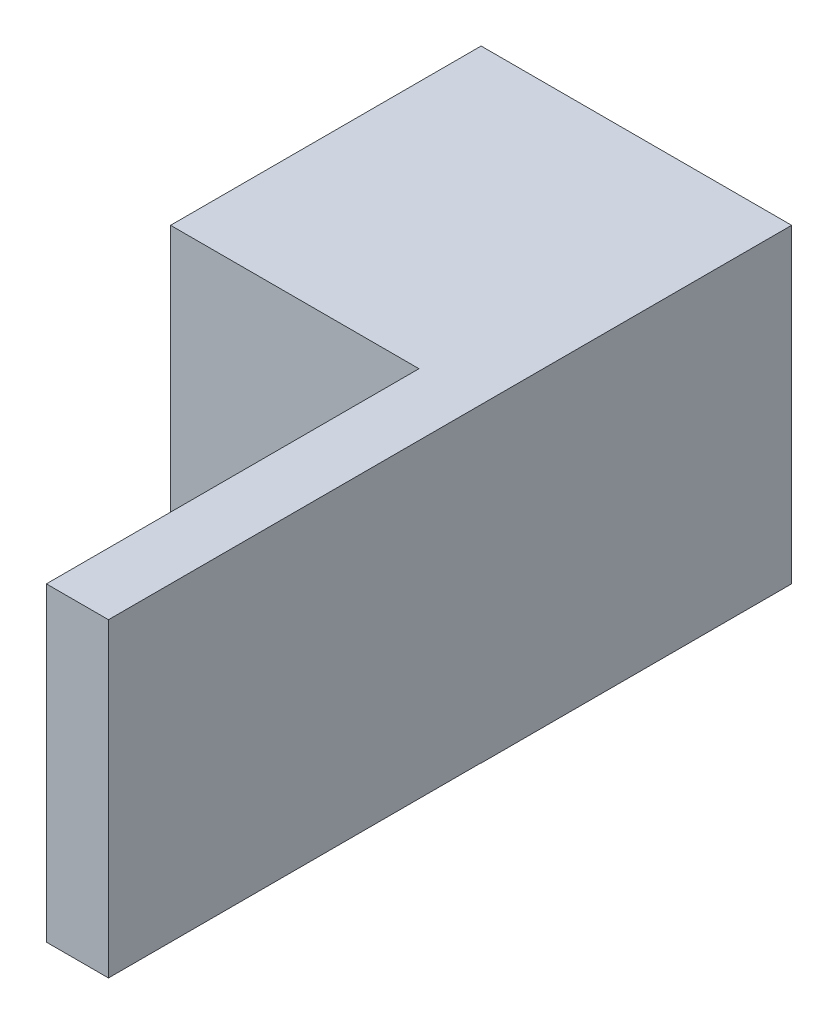
ISO-10303-21;
HEADER;
FILE_DESCRIPTION(('STEP AP214'),'2;1');
FILE_NAME('part.step','',(''),(''),'','','');
FILE_SCHEMA(('AUTOMOTIVE_DESIGN { 1 0 10303 214 1 1 1 1 }'));
ENDSEC;
DATA;
#1=APPLICATION_CONTEXT('core data for automotive mechanical design processes');
#2=APPLICATION_PROTOCOL_DEFINITION('international standard','automotive_design',2000,#1);
#3=PRODUCT_CONTEXT('',#1,'mechanical');
#4=PRODUCT('Part','Part','',(#3));
#5=PRODUCT_RELATED_PRODUCT_CATEGORY('part','',(#4));
#6=PRODUCT_DEFINITION_FORMATION('','',#4);
#7=PRODUCT_DEFINITION_CONTEXT('part definition',#1,'design');
#8=PRODUCT_DEFINITION('design','',#6,#7);
#9=PRODUCT_DEFINITION_SHAPE('','',#8);
#10=(LENGTH_UNIT() NAMED_UNIT(*) SI_UNIT(.MILLI.,.METRE.));
#11=(NAMED_UNIT(*) PLANE_ANGLE_UNIT() SI_UNIT($,.RADIAN.));
#12=(NAMED_UNIT(*) SI_UNIT($,.STERADIAN.) SOLID_ANGLE_UNIT());
#13=UNCERTAINTY_MEASURE_WITH_UNIT(LENGTH_MEASURE(1.E-05),#10,'distance_accuracy_value','');
#14=(GEOMETRIC_REPRESENTATION_CONTEXT(3) GLOBAL_UNCERTAINTY_ASSIGNED_CONTEXT((#13)) GLOBAL_UNIT_ASSIGNED_CONTEXT((#10,
#11,#12)) REPRESENTATION_CONTEXT('',''));
#15=CARTESIAN_POINT('',(0.,0.,0.));
#16=DIRECTION('',(0.,0.,1.));
#17=DIRECTION('',(1.,0.,0.));
#18=AXIS2_PLACEMENT_3D('',#15,#16,#17);
#19=CARTESIAN_POINT('',(42.2647962820917,-500.,500.));
#20=DIRECTION('',(-1.,0.,0.));
#21=DIRECTION('',(0.,0.,1.));
#22=AXIS2_PLACEMENT_3D('',#19,#20,#21);
#23=PLANE('',#22);
#24=DIRECTION('',(0.,1.,0.));
#25=VECTOR('',#24,1.);
#26=CARTESIAN_POINT('',(42.2647962820917,-500.,0.));
#27=LINE('',#26,#25);
#28=CARTESIAN_POINT('',(42.2647962820917,-500.,0.));
#29=VERTEX_POINT('',#28);
#30=CARTESIAN_POINT('',(42.2647962820917,0.,0.));
#31=VERTEX_POINT('',#30);
#32=EDGE_CURVE('E122',#29,#31,#27,.T.);
#33=ORIENTED_EDGE('',*,*,#32,.T.);
#34=DIRECTION('',(0.,0.,-1.));
#35=VECTOR('',#34,1.);
#36=CARTESIAN_POINT('',(42.2647962820917,0.,500.));
#37=LINE('',#36,#35);
#38=CARTESIAN_POINT('',(42.2647962820917,0.,1100.));
#39=VERTEX_POINT('',#38);
#40=EDGE_CURVE('E11',#39,#31,#37,.T.);
#41=ORIENTED_EDGE('',*,*,#40,.F.);
#42=DIRECTION('',(0.,-1.,0.));
#43=VECTOR('',#42,1.);
#44=CARTESIAN_POINT('',(42.2647962820917,0.,1100.));
#45=LINE('',#44,#43);
#46=CARTESIAN_POINT('',(42.2647962820917,-499.616763285921,1100.));
#47=VERTEX_POINT('',#46);
#48=EDGE_CURVE('E107',#39,#47,#45,.T.);
#49=ORIENTED_EDGE('',*,*,#48,.T.);
#50=DIRECTION('',(0.,0.,-1.));
#51=VECTOR('',#50,1.);
#52=CARTESIAN_POINT('',(42.2647962820917,-499.616763285921,1100.));
#53=LINE('',#52,#51);
#54=CARTESIAN_POINT('',(42.2647962820917,-499.616763285921,500.));
#55=VERTEX_POINT('',#54);
#56=EDGE_CURVE('E91',#47,#55,#53,.T.);
#57=ORIENTED_EDGE('',*,*,#56,.T.);
#58=DIRECTION('',(0.,1.,0.));
#59=VECTOR('',#58,1.);
#60=CARTESIAN_POINT('',(42.2647962820917,-500.,500.));
#61=LINE('',#60,#59);
#62=CARTESIAN_POINT('',(42.2647962820917,-500.,500.));
#63=VERTEX_POINT('',#62);
#64=EDGE_CURVE('E123',#63,#55,#61,.T.);
#65=ORIENTED_EDGE('',*,*,#64,.F.);
#66=DIRECTION('',(0.,0.,-1.));
#67=VECTOR('',#66,1.);
#68=CARTESIAN_POINT('',(42.2647962820917,-500.,500.));
#69=LINE('',#68,#67);
#70=EDGE_CURVE('E132',#63,#29,#69,.T.);
#71=ORIENTED_EDGE('',*,*,#70,.T.);
#72=EDGE_LOOP('',(#33,#41,#49,#57,#65,#71));
#73=FACE_BOUND('',#72,.T.);
#74=ADVANCED_FACE('F35',(#73),#23,.F.);
#75=CARTESIAN_POINT('',(42.2647962820917,0.,500.));
#76=DIRECTION('',(0.,-1.,0.));
#77=DIRECTION('',(1.,0.,0.));
#78=AXIS2_PLACEMENT_3D('',#75,#76,#77);
#79=PLANE('',#78);
#80=DIRECTION('',(-1.,0.,0.));
#81=VECTOR('',#80,1.);
#82=CARTESIAN_POINT('',(42.2647962820917,0.,500.));
#83=LINE('',#82,#81);
#84=CARTESIAN_POINT('',(-57.7352037179084,0.,500.));
#85=VERTEX_POINT('',#84);
#86=CARTESIAN_POINT('',(-457.735203717908,0.,500.));
#87=VERTEX_POINT('',#86);
#88=EDGE_CURVE('E125',#85,#87,#83,.T.);
#89=ORIENTED_EDGE('',*,*,#88,.F.);
#90=DIRECTION('',(0.,0.,-1.));
#91=VECTOR('',#90,1.);
#92=CARTESIAN_POINT('',(-57.7352037179083,0.,1100.));
#93=LINE('',#92,#91);
#94=CARTESIAN_POINT('',(-57.7352037179083,0.,1100.));
#95=VERTEX_POINT('',#94);
#96=EDGE_CURVE('E116',#95,#85,#93,.T.);
#97=ORIENTED_EDGE('',*,*,#96,.F.);
#98=DIRECTION('',(1.,0.,0.));
#99=VECTOR('',#98,1.);
#100=CARTESIAN_POINT('',(42.2647962820917,0.,1100.));
#101=LINE('',#100,#99);
#102=EDGE_CURVE('E100',#95,#39,#101,.T.);
#103=ORIENTED_EDGE('',*,*,#102,.T.);
#104=ORIENTED_EDGE('',*,*,#40,.T.);
#105=DIRECTION('',(-1.,0.,0.));
#106=VECTOR('',#105,1.);
#107=CARTESIAN_POINT('',(42.2647962820917,0.,0.));
#108=LINE('',#107,#106);
#109=CARTESIAN_POINT('',(-457.735203717908,0.,0.));
#110=VERTEX_POINT('',#109);
#111=EDGE_CURVE('E134',#31,#110,#108,.T.);
#112=ORIENTED_EDGE('',*,*,#111,.T.);
#113=DIRECTION('',(0.,0.,-1.));
#114=VECTOR('',#113,1.);
#115=CARTESIAN_POINT('',(-457.735203717908,0.,500.));
#116=LINE('',#115,#114);
#117=EDGE_CURVE('E42',#87,#110,#116,.T.);
#118=ORIENTED_EDGE('',*,*,#117,.F.);
#119=EDGE_LOOP('',(#89,#97,#103,#104,#112,#118));
#120=FACE_BOUND('',#119,.T.);
#121=ADVANCED_FACE('F161',(#120),#79,.F.);
#122=CARTESIAN_POINT('',(-457.735203717908,-500.,500.));
#123=DIRECTION('',(1.,0.,0.));
#124=DIRECTION('',(0.,0.,-1.));
#125=AXIS2_PLACEMENT_3D('',#122,#123,#124);
#126=PLANE('',#125);
#127=DIRECTION('',(0.,-1.,0.));
#128=VECTOR('',#127,1.);
#129=CARTESIAN_POINT('',(-457.735203717908,-500.,0.));
#130=LINE('',#129,#128);
#131=CARTESIAN_POINT('',(-457.735203717908,-500.,0.));
#132=VERTEX_POINT('',#131);
#133=EDGE_CURVE('E136',#110,#132,#130,.T.);
#134=ORIENTED_EDGE('',*,*,#133,.T.);
#135=DIRECTION('',(0.,0.,-1.));
#136=VECTOR('',#135,1.);
#137=CARTESIAN_POINT('',(-457.735203717908,-500.,500.));
#138=LINE('',#137,#136);
#139=CARTESIAN_POINT('',(-457.735203717908,-500.,500.));
#140=VERTEX_POINT('',#139);
#141=EDGE_CURVE('E141',#140,#132,#138,.T.);
#142=ORIENTED_EDGE('',*,*,#141,.F.);
#143=DIRECTION('',(0.,-1.,0.));
#144=VECTOR('',#143,1.);
#145=CARTESIAN_POINT('',(-457.735203717908,-500.,500.));
#146=LINE('',#145,#144);
#147=EDGE_CURVE('E128',#87,#140,#146,.T.);
#148=ORIENTED_EDGE('',*,*,#147,.F.);
#149=ORIENTED_EDGE('',*,*,#117,.T.);
#150=EDGE_LOOP('',(#134,#142,#148,#149));
#151=FACE_BOUND('',#150,.T.);
#152=ADVANCED_FACE('F148',(#151),#126,.F.);
#153=CARTESIAN_POINT('',(42.2647962820917,-500.,500.));
#154=DIRECTION('',(0.,1.,0.));
#155=DIRECTION('',(0.,0.,1.));
#156=AXIS2_PLACEMENT_3D('',#153,#154,#155);
#157=PLANE('',#156);
#158=DIRECTION('',(1.,0.,0.));
#159=VECTOR('',#158,1.);
#160=CARTESIAN_POINT('',(42.2647962820917,-500.,0.));
#161=LINE('',#160,#159);
#162=EDGE_CURVE('E126',#132,#29,#161,.T.);
#163=ORIENTED_EDGE('',*,*,#162,.T.);
#164=ORIENTED_EDGE('',*,*,#70,.F.);
#165=DIRECTION('',(1.,0.,0.));
#166=VECTOR('',#165,1.);
#167=CARTESIAN_POINT('',(42.2647962820917,-500.,500.));
#168=LINE('',#167,#166);
#169=EDGE_CURVE('E130',#140,#63,#168,.T.);
#170=ORIENTED_EDGE('',*,*,#169,.F.);
#171=ORIENTED_EDGE('',*,*,#141,.T.);
#172=EDGE_LOOP('',(#163,#164,#170,#171));
#173=FACE_BOUND('',#172,.T.);
#174=ADVANCED_FACE('F158',(#173),#157,.F.);
#175=CARTESIAN_POINT('',(0.,0.,500.));
#176=DIRECTION('',(0.,0.,1.));
#177=DIRECTION('',(1.,0.,0.));
#178=AXIS2_PLACEMENT_3D('',#175,#176,#177);
#179=PLANE('',#178);
#180=DIRECTION('',(0.,-1.,0.));
#181=VECTOR('',#180,1.);
#182=CARTESIAN_POINT('',(-57.7352037179083,0.,500.));
#183=LINE('',#182,#181);
#184=CARTESIAN_POINT('',(-57.7352037179084,-499.616763285921,500.));
#185=VERTEX_POINT('',#184);
#186=EDGE_CURVE('E53',#85,#185,#183,.T.);
#187=ORIENTED_EDGE('',*,*,#186,.F.);
#188=ORIENTED_EDGE('',*,*,#88,.T.);
#189=ORIENTED_EDGE('',*,*,#147,.T.);
#190=ORIENTED_EDGE('',*,*,#169,.T.);
#191=ORIENTED_EDGE('',*,*,#64,.T.);
#192=DIRECTION('',(1.,0.,0.));
#193=VECTOR('',#192,1.);
#194=CARTESIAN_POINT('',(0.,-499.616763285921,500.));
#195=LINE('',#194,#193);
#196=EDGE_CURVE('E49',#185,#55,#195,.T.);
#197=ORIENTED_EDGE('',*,*,#196,.F.);
#198=EDGE_LOOP('',(#187,#188,#189,#190,#191,#197));
#199=FACE_BOUND('',#198,.T.);
#200=ADVANCED_FACE('F160',(#199),#179,.T.);
#201=CARTESIAN_POINT('',(0.,0.,0.));
#202=DIRECTION('',(0.,0.,1.));
#203=DIRECTION('',(1.,0.,0.));
#204=AXIS2_PLACEMENT_3D('',#201,#202,#203);
#205=PLANE('',#204);
#206=ORIENTED_EDGE('',*,*,#133,.F.);
#207=ORIENTED_EDGE('',*,*,#111,.F.);
#208=ORIENTED_EDGE('',*,*,#32,.F.);
#209=ORIENTED_EDGE('',*,*,#162,.F.);
#210=EDGE_LOOP('',(#206,#207,#208,#209));
#211=FACE_BOUND('',#210,.T.);
#212=ADVANCED_FACE('F154',(#211),#205,.F.);
#213=CARTESIAN_POINT('',(-57.7352037179083,0.,1100.));
#214=DIRECTION('',(-1.,0.,0.));
#215=DIRECTION('',(0.,-1.,0.));
#216=AXIS2_PLACEMENT_3D('',#213,#214,#215);
#217=PLANE('',#216);
#218=ORIENTED_EDGE('',*,*,#96,.T.);
#219=ORIENTED_EDGE('',*,*,#186,.T.);
#220=DIRECTION('',(0.,0.,-1.));
#221=VECTOR('',#220,1.);
#222=CARTESIAN_POINT('',(-57.7352037179084,-499.616763285921,1100.));
#223=LINE('',#222,#221);
#224=CARTESIAN_POINT('',(-57.7352037179084,-499.616763285921,1100.));
#225=VERTEX_POINT('',#224);
#226=EDGE_CURVE('E99',#225,#185,#223,.T.);
#227=ORIENTED_EDGE('',*,*,#226,.F.);
#228=DIRECTION('',(0.,1.,0.));
#229=VECTOR('',#228,1.);
#230=CARTESIAN_POINT('',(-57.7352037179083,0.,1100.));
#231=LINE('',#230,#229);
#232=EDGE_CURVE('E110',#225,#95,#231,.T.);
#233=ORIENTED_EDGE('',*,*,#232,.T.);
#234=EDGE_LOOP('',(#218,#219,#227,#233));
#235=FACE_BOUND('',#234,.T.);
#236=ADVANCED_FACE('F163',(#235),#217,.T.);
#237=CARTESIAN_POINT('',(42.2647962820917,-499.616763285921,1100.));
#238=DIRECTION('',(0.,-1.,0.));
#239=DIRECTION('',(0.,0.,-1.));
#240=AXIS2_PLACEMENT_3D('',#237,#238,#239);
#241=PLANE('',#240);
#242=ORIENTED_EDGE('',*,*,#226,.T.);
#243=ORIENTED_EDGE('',*,*,#196,.T.);
#244=ORIENTED_EDGE('',*,*,#56,.F.);
#245=DIRECTION('',(-1.,0.,0.));
#246=VECTOR('',#245,1.);
#247=CARTESIAN_POINT('',(42.2647962820917,-499.616763285921,1100.));
#248=LINE('',#247,#246);
#249=EDGE_CURVE('E95',#47,#225,#248,.T.);
#250=ORIENTED_EDGE('',*,*,#249,.T.);
#251=EDGE_LOOP('',(#242,#243,#244,#250));
#252=FACE_BOUND('',#251,.T.);
#253=ADVANCED_FACE('F94',(#252),#241,.T.);
#254=CARTESIAN_POINT('',(0.,0.,1100.));
#255=DIRECTION('',(0.,0.,-1.));
#256=DIRECTION('',(-1.,0.,0.));
#257=AXIS2_PLACEMENT_3D('',#254,#255,#256);
#258=PLANE('',#257);
#259=ORIENTED_EDGE('',*,*,#48,.F.);
#260=ORIENTED_EDGE('',*,*,#102,.F.);
#261=ORIENTED_EDGE('',*,*,#232,.F.);
#262=ORIENTED_EDGE('',*,*,#249,.F.);
#263=EDGE_LOOP('',(#259,#260,#261,#262));
#264=FACE_BOUND('',#263,.T.);
#265=ADVANCED_FACE('F105',(#264),#258,.F.);
#266=CLOSED_SHELL('',(#74,#121,#152,#174,#200,#212,#236,#253,#265));
#267=MANIFOLD_SOLID_BREP('B2',#266);
#268=ADVANCED_BREP_SHAPE_REPRESENTATION('',(#18,#267),#14);
#269=SHAPE_DEFINITION_REPRESENTATION(#9,#268);
ENDSEC;
END-ISO-10303-21;
